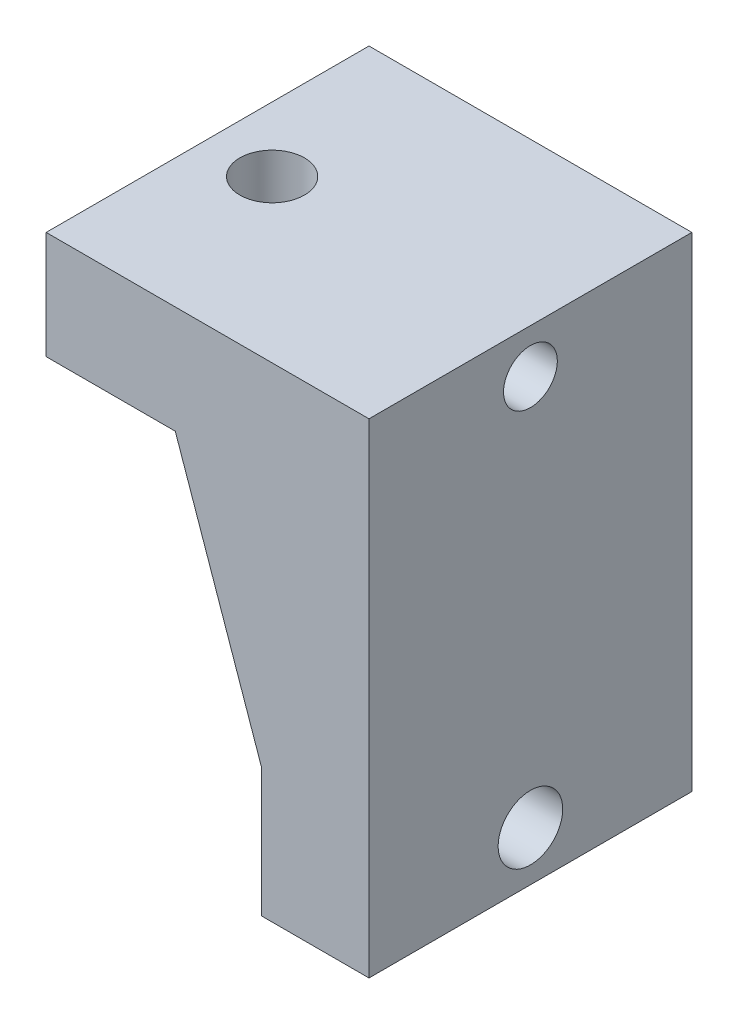
ISO-10303-21;
HEADER;
FILE_DESCRIPTION(('STEP AP214'),'2;1');
FILE_NAME('part.step','',(''),(''),'','','');
FILE_SCHEMA(('AUTOMOTIVE_DESIGN { 1 0 10303 214 1 1 1 1 }'));
ENDSEC;
DATA;
#1=APPLICATION_CONTEXT('core data for automotive mechanical design processes');
#2=APPLICATION_PROTOCOL_DEFINITION('international standard','automotive_design',2000,#1);
#3=PRODUCT_CONTEXT('',#1,'mechanical');
#4=PRODUCT('Part','Part','',(#3));
#5=PRODUCT_RELATED_PRODUCT_CATEGORY('part','',(#4));
#6=PRODUCT_DEFINITION_FORMATION('','',#4);
#7=PRODUCT_DEFINITION_CONTEXT('part definition',#1,'design');
#8=PRODUCT_DEFINITION('design','',#6,#7);
#9=PRODUCT_DEFINITION_SHAPE('','',#8);
#10=(LENGTH_UNIT() NAMED_UNIT(*) SI_UNIT(.MILLI.,.METRE.));
#11=(NAMED_UNIT(*) PLANE_ANGLE_UNIT() SI_UNIT($,.RADIAN.));
#12=(NAMED_UNIT(*) SI_UNIT($,.STERADIAN.) SOLID_ANGLE_UNIT());
#13=UNCERTAINTY_MEASURE_WITH_UNIT(LENGTH_MEASURE(1.E-05),#10,'distance_accuracy_value','');
#14=(GEOMETRIC_REPRESENTATION_CONTEXT(3) GLOBAL_UNCERTAINTY_ASSIGNED_CONTEXT((#13)) GLOBAL_UNIT_ASSIGNED_CONTEXT((#10,
#11,#12)) REPRESENTATION_CONTEXT('',''));
#15=CARTESIAN_POINT('',(0.,0.,0.));
#16=DIRECTION('',(0.,0.,1.));
#17=DIRECTION('',(1.,0.,0.));
#18=AXIS2_PLACEMENT_3D('',#15,#16,#17);
#19=CARTESIAN_POINT('',(0.,-20.,15.));
#20=DIRECTION('',(0.,-1.,0.));
#21=DIRECTION('',(0.,0.,-1.));
#22=AXIS2_PLACEMENT_3D('',#19,#20,#21);
#23=PLANE('',#22);
#24=DIRECTION('',(-1.,0.,0.));
#25=VECTOR('',#24,1.);
#26=CARTESIAN_POINT('',(0.,-20.,0.));
#27=LINE('',#26,#25);
#28=CARTESIAN_POINT('',(7.5,-20.,0.));
#29=VERTEX_POINT('',#28);
#30=CARTESIAN_POINT('',(2.5,-20.,0.));
#31=VERTEX_POINT('',#30);
#32=EDGE_CURVE('E122',#29,#31,#27,.T.);
#33=ORIENTED_EDGE('',*,*,#32,.F.);
#34=DIRECTION('',(0.,0.,-1.));
#35=VECTOR('',#34,1.);
#36=CARTESIAN_POINT('',(7.5,-20.,15.));
#37=LINE('',#36,#35);
#38=CARTESIAN_POINT('',(7.5,-20.,15.));
#39=VERTEX_POINT('',#38);
#40=EDGE_CURVE('E11',#39,#29,#37,.T.);
#41=ORIENTED_EDGE('',*,*,#40,.F.);
#42=DIRECTION('',(-1.,0.,0.));
#43=VECTOR('',#42,1.);
#44=CARTESIAN_POINT('',(0.,-20.,15.));
#45=LINE('',#44,#43);
#46=CARTESIAN_POINT('',(2.5,-20.,15.));
#47=VERTEX_POINT('',#46);
#48=EDGE_CURVE('E138',#39,#47,#45,.T.);
#49=ORIENTED_EDGE('',*,*,#48,.T.);
#50=DIRECTION('',(0.,0.,-1.));
#51=VECTOR('',#50,1.);
#52=CARTESIAN_POINT('',(2.5,-20.,15.));
#53=LINE('',#52,#51);
#54=EDGE_CURVE('E83',#47,#31,#53,.T.);
#55=ORIENTED_EDGE('',*,*,#54,.T.);
#56=EDGE_LOOP('',(#33,#41,#49,#55));
#57=FACE_BOUND('',#56,.T.);
#58=ADVANCED_FACE('F34',(#57),#23,.T.);
#59=CARTESIAN_POINT('',(7.5,0.,15.));
#60=DIRECTION('',(-1.,0.,0.));
#61=DIRECTION('',(0.,-1.,0.));
#62=AXIS2_PLACEMENT_3D('',#59,#60,#61);
#63=PLANE('',#62);
#64=CARTESIAN_POINT('',(7.5,0.450000000000004,7.5));
#65=DIRECTION('',(1.,0.,0.));
#66=DIRECTION('',(0.,1.,0.));
#67=AXIS2_PLACEMENT_3D('',#64,#65,#66);
#68=CIRCLE('',#67,1.25);
#69=CARTESIAN_POINT('',(7.5,1.7,7.5));
#70=VERTEX_POINT('',#69);
#71=EDGE_CURVE('E166',#70,#70,#68,.T.);
#72=ORIENTED_EDGE('',*,*,#71,.F.);
#73=EDGE_LOOP('',(#72));
#74=FACE_BOUND('',#73,.T.);
#75=CARTESIAN_POINT('',(7.50000000000001,-17.7,7.5));
#76=DIRECTION('',(1.,0.,0.));
#77=DIRECTION('',(0.,1.,0.));
#78=AXIS2_PLACEMENT_3D('',#75,#76,#77);
#79=CIRCLE('',#78,1.5);
#80=CARTESIAN_POINT('',(7.50000000000001,-16.2,7.5));
#81=VERTEX_POINT('',#80);
#82=EDGE_CURVE('E163',#81,#81,#79,.T.);
#83=ORIENTED_EDGE('',*,*,#82,.F.);
#84=EDGE_LOOP('',(#83));
#85=FACE_BOUND('',#84,.T.);
#86=DIRECTION('',(0.,1.,0.));
#87=VECTOR('',#86,1.);
#88=CARTESIAN_POINT('',(7.5,0.,0.));
#89=LINE('',#88,#87);
#90=CARTESIAN_POINT('',(7.5,2.5,0.));
#91=VERTEX_POINT('',#90);
#92=EDGE_CURVE('E125',#29,#91,#89,.T.);
#93=ORIENTED_EDGE('',*,*,#92,.T.);
#94=DIRECTION('',(0.,0.,-1.));
#95=VECTOR('',#94,1.);
#96=CARTESIAN_POINT('',(7.5,2.5,15.));
#97=LINE('',#96,#95);
#98=CARTESIAN_POINT('',(7.5,2.5,15.));
#99=VERTEX_POINT('',#98);
#100=EDGE_CURVE('E43',#99,#91,#97,.T.);
#101=ORIENTED_EDGE('',*,*,#100,.F.);
#102=DIRECTION('',(0.,1.,0.));
#103=VECTOR('',#102,1.);
#104=CARTESIAN_POINT('',(7.5,0.,15.));
#105=LINE('',#104,#103);
#106=EDGE_CURVE('E158',#39,#99,#105,.T.);
#107=ORIENTED_EDGE('',*,*,#106,.F.);
#108=ORIENTED_EDGE('',*,*,#40,.T.);
#109=EDGE_LOOP('',(#93,#101,#107,#108));
#110=FACE_BOUND('',#109,.T.);
#111=ADVANCED_FACE('F152',(#74,#85,#110),#63,.F.);
#112=CARTESIAN_POINT('',(0.,2.5,15.));
#113=DIRECTION('',(0.,1.,0.));
#114=DIRECTION('',(0.,0.,1.));
#115=AXIS2_PLACEMENT_3D('',#112,#113,#114);
#116=PLANE('',#115);
#117=CARTESIAN_POINT('',(-4.5,2.5,7.5));
#118=DIRECTION('',(0.,1.,0.));
#119=DIRECTION('',(0.,0.,1.));
#120=AXIS2_PLACEMENT_3D('',#117,#118,#119);
#121=CIRCLE('',#120,1.5);
#122=CARTESIAN_POINT('',(-4.5,2.5,9.));
#123=VERTEX_POINT('',#122);
#124=EDGE_CURVE('E167',#123,#123,#121,.T.);
#125=ORIENTED_EDGE('',*,*,#124,.F.);
#126=EDGE_LOOP('',(#125));
#127=FACE_BOUND('',#126,.T.);
#128=DIRECTION('',(1.,0.,0.));
#129=VECTOR('',#128,1.);
#130=CARTESIAN_POINT('',(0.,2.5,0.));
#131=LINE('',#130,#129);
#132=CARTESIAN_POINT('',(-7.5,2.5,0.));
#133=VERTEX_POINT('',#132);
#134=EDGE_CURVE('E128',#133,#91,#131,.T.);
#135=ORIENTED_EDGE('',*,*,#134,.F.);
#136=DIRECTION('',(0.,0.,-1.));
#137=VECTOR('',#136,1.);
#138=CARTESIAN_POINT('',(-7.5,2.5,15.));
#139=LINE('',#138,#137);
#140=CARTESIAN_POINT('',(-7.5,2.5,15.));
#141=VERTEX_POINT('',#140);
#142=EDGE_CURVE('E142',#141,#133,#139,.T.);
#143=ORIENTED_EDGE('',*,*,#142,.F.);
#144=DIRECTION('',(1.,0.,0.));
#145=VECTOR('',#144,1.);
#146=CARTESIAN_POINT('',(0.,2.5,15.));
#147=LINE('',#146,#145);
#148=EDGE_CURVE('E149',#141,#99,#147,.T.);
#149=ORIENTED_EDGE('',*,*,#148,.T.);
#150=ORIENTED_EDGE('',*,*,#100,.T.);
#151=EDGE_LOOP('',(#135,#143,#149,#150));
#152=FACE_BOUND('',#151,.T.);
#153=ADVANCED_FACE('F148',(#127,#152),#116,.T.);
#154=CARTESIAN_POINT('',(-7.5,0.,15.));
#155=DIRECTION('',(-1.,0.,0.));
#156=DIRECTION('',(0.,0.,1.));
#157=AXIS2_PLACEMENT_3D('',#154,#155,#156);
#158=PLANE('',#157);
#159=DIRECTION('',(0.,1.,0.));
#160=VECTOR('',#159,1.);
#161=CARTESIAN_POINT('',(-7.5,0.,0.));
#162=LINE('',#161,#160);
#163=CARTESIAN_POINT('',(-7.5,-2.5,0.));
#164=VERTEX_POINT('',#163);
#165=EDGE_CURVE('E131',#164,#133,#162,.T.);
#166=ORIENTED_EDGE('',*,*,#165,.F.);
#167=DIRECTION('',(0.,0.,-1.));
#168=VECTOR('',#167,1.);
#169=CARTESIAN_POINT('',(-7.5,-2.5,15.));
#170=LINE('',#169,#168);
#171=CARTESIAN_POINT('',(-7.5,-2.5,15.));
#172=VERTEX_POINT('',#171);
#173=EDGE_CURVE('E114',#172,#164,#170,.T.);
#174=ORIENTED_EDGE('',*,*,#173,.F.);
#175=DIRECTION('',(0.,1.,0.));
#176=VECTOR('',#175,1.);
#177=CARTESIAN_POINT('',(-7.5,0.,15.));
#178=LINE('',#177,#176);
#179=EDGE_CURVE('E107',#172,#141,#178,.T.);
#180=ORIENTED_EDGE('',*,*,#179,.T.);
#181=ORIENTED_EDGE('',*,*,#142,.T.);
#182=EDGE_LOOP('',(#166,#174,#180,#181));
#183=FACE_BOUND('',#182,.T.);
#184=ADVANCED_FACE('F157',(#183),#158,.T.);
#185=CARTESIAN_POINT('',(0.,-2.5,15.));
#186=DIRECTION('',(0.,1.,0.));
#187=DIRECTION('',(0.,0.,1.));
#188=AXIS2_PLACEMENT_3D('',#185,#186,#187);
#189=PLANE('',#188);
#190=CARTESIAN_POINT('',(-4.5,-2.5,7.5));
#191=DIRECTION('',(0.,-1.,0.));
#192=DIRECTION('',(0.,0.,-1.));
#193=AXIS2_PLACEMENT_3D('',#190,#191,#192);
#194=CIRCLE('',#193,1.5);
#195=CARTESIAN_POINT('',(-4.5,-2.5,6.));
#196=VERTEX_POINT('',#195);
#197=EDGE_CURVE('E175',#196,#196,#194,.T.);
#198=ORIENTED_EDGE('',*,*,#197,.F.);
#199=EDGE_LOOP('',(#198));
#200=FACE_BOUND('',#199,.T.);
#201=DIRECTION('',(1.,0.,0.));
#202=VECTOR('',#201,1.);
#203=CARTESIAN_POINT('',(0.,-2.5,0.));
#204=LINE('',#203,#202);
#205=CARTESIAN_POINT('',(-1.5,-2.5,0.));
#206=VERTEX_POINT('',#205);
#207=EDGE_CURVE('E113',#164,#206,#204,.T.);
#208=ORIENTED_EDGE('',*,*,#207,.T.);
#209=DIRECTION('',(0.,0.,-1.));
#210=VECTOR('',#209,1.);
#211=CARTESIAN_POINT('',(-1.5,-2.5,15.));
#212=LINE('',#211,#210);
#213=CARTESIAN_POINT('',(-1.5,-2.5,15.));
#214=VERTEX_POINT('',#213);
#215=EDGE_CURVE('E110',#214,#206,#212,.T.);
#216=ORIENTED_EDGE('',*,*,#215,.F.);
#217=DIRECTION('',(1.,0.,0.));
#218=VECTOR('',#217,1.);
#219=CARTESIAN_POINT('',(0.,-2.5,15.));
#220=LINE('',#219,#218);
#221=EDGE_CURVE('E100',#172,#214,#220,.T.);
#222=ORIENTED_EDGE('',*,*,#221,.F.);
#223=ORIENTED_EDGE('',*,*,#173,.T.);
#224=EDGE_LOOP('',(#208,#216,#222,#223));
#225=FACE_BOUND('',#224,.T.);
#226=ADVANCED_FACE('F111',(#200,#225),#189,.F.);
#227=CARTESIAN_POINT('',(-2.11382799325464,-0.735244519392916,15.));
#228=DIRECTION('',(0.944496796706159,0.328520624941273,0.));
#229=DIRECTION('',(-0.328520624941273,0.944496796706159,0.));
#230=AXIS2_PLACEMENT_3D('',#227,#228,#229);
#231=PLANE('',#230);
#232=DIRECTION('',(0.328520624941273,-0.944496796706159,0.));
#233=VECTOR('',#232,1.);
#234=CARTESIAN_POINT('',(-2.11382799325464,-0.735244519392916,0.));
#235=LINE('',#234,#233);
#236=CARTESIAN_POINT('',(2.5,-14.,0.));
#237=VERTEX_POINT('',#236);
#238=EDGE_CURVE('E76',#206,#237,#235,.T.);
#239=ORIENTED_EDGE('',*,*,#238,.T.);
#240=DIRECTION('',(0.,0.,-1.));
#241=VECTOR('',#240,1.);
#242=CARTESIAN_POINT('',(2.5,-14.,15.));
#243=LINE('',#242,#241);
#244=CARTESIAN_POINT('',(2.5,-14.,15.));
#245=VERTEX_POINT('',#244);
#246=EDGE_CURVE('E115',#245,#237,#243,.T.);
#247=ORIENTED_EDGE('',*,*,#246,.F.);
#248=DIRECTION('',(0.328520624941273,-0.944496796706159,0.));
#249=VECTOR('',#248,1.);
#250=CARTESIAN_POINT('',(-2.11382799325464,-0.735244519392916,15.));
#251=LINE('',#250,#249);
#252=EDGE_CURVE('E104',#214,#245,#251,.T.);
#253=ORIENTED_EDGE('',*,*,#252,.F.);
#254=ORIENTED_EDGE('',*,*,#215,.T.);
#255=EDGE_LOOP('',(#239,#247,#253,#254));
#256=FACE_BOUND('',#255,.T.);
#257=ADVANCED_FACE('F117',(#256),#231,.F.);
#258=CARTESIAN_POINT('',(2.5,0.,15.));
#259=DIRECTION('',(1.,0.,0.));
#260=DIRECTION('',(0.,1.,0.));
#261=AXIS2_PLACEMENT_3D('',#258,#259,#260);
#262=PLANE('',#261);
#263=CARTESIAN_POINT('',(2.5,-17.7,7.5));
#264=DIRECTION('',(1.,0.,0.));
#265=DIRECTION('',(0.,1.,0.));
#266=AXIS2_PLACEMENT_3D('',#263,#264,#265);
#267=CIRCLE('',#266,1.5);
#268=CARTESIAN_POINT('',(2.5,-16.2,7.5));
#269=VERTEX_POINT('',#268);
#270=EDGE_CURVE('E37',#269,#269,#267,.T.);
#271=ORIENTED_EDGE('',*,*,#270,.T.);
#272=EDGE_LOOP('',(#271));
#273=FACE_BOUND('',#272,.T.);
#274=DIRECTION('',(0.,-1.,0.));
#275=VECTOR('',#274,1.);
#276=CARTESIAN_POINT('',(2.5,0.,0.));
#277=LINE('',#276,#275);
#278=EDGE_CURVE('E136',#237,#31,#277,.T.);
#279=ORIENTED_EDGE('',*,*,#278,.T.);
#280=ORIENTED_EDGE('',*,*,#54,.F.);
#281=DIRECTION('',(0.,-1.,0.));
#282=VECTOR('',#281,1.);
#283=CARTESIAN_POINT('',(2.5,0.,15.));
#284=LINE('',#283,#282);
#285=EDGE_CURVE('E51',#245,#47,#284,.T.);
#286=ORIENTED_EDGE('',*,*,#285,.F.);
#287=ORIENTED_EDGE('',*,*,#246,.T.);
#288=EDGE_LOOP('',(#279,#280,#286,#287));
#289=FACE_BOUND('',#288,.T.);
#290=ADVANCED_FACE('F187',(#273,#289),#262,.F.);
#291=CARTESIAN_POINT('',(0.,0.,15.));
#292=DIRECTION('',(0.,0.,1.));
#293=DIRECTION('',(1.,0.,0.));
#294=AXIS2_PLACEMENT_3D('',#291,#292,#293);
#295=PLANE('',#294);
#296=ORIENTED_EDGE('',*,*,#48,.F.);
#297=ORIENTED_EDGE('',*,*,#106,.T.);
#298=ORIENTED_EDGE('',*,*,#148,.F.);
#299=ORIENTED_EDGE('',*,*,#179,.F.);
#300=ORIENTED_EDGE('',*,*,#221,.T.);
#301=ORIENTED_EDGE('',*,*,#252,.T.);
#302=ORIENTED_EDGE('',*,*,#285,.T.);
#303=EDGE_LOOP('',(#296,#297,#298,#299,#300,#301,#302));
#304=FACE_BOUND('',#303,.T.);
#305=ADVANCED_FACE('F102',(#304),#295,.T.);
#306=CARTESIAN_POINT('',(0.,0.,0.));
#307=DIRECTION('',(0.,0.,1.));
#308=DIRECTION('',(1.,0.,0.));
#309=AXIS2_PLACEMENT_3D('',#306,#307,#308);
#310=PLANE('',#309);
#311=ORIENTED_EDGE('',*,*,#32,.T.);
#312=ORIENTED_EDGE('',*,*,#278,.F.);
#313=ORIENTED_EDGE('',*,*,#238,.F.);
#314=ORIENTED_EDGE('',*,*,#207,.F.);
#315=ORIENTED_EDGE('',*,*,#165,.T.);
#316=ORIENTED_EDGE('',*,*,#134,.T.);
#317=ORIENTED_EDGE('',*,*,#92,.F.);
#318=EDGE_LOOP('',(#311,#312,#313,#314,#315,#316,#317));
#319=FACE_BOUND('',#318,.T.);
#320=ADVANCED_FACE('F154',(#319),#310,.F.);
#321=CARTESIAN_POINT('',(-1.49999999999998,-17.7,7.5));
#322=DIRECTION('',(1.,0.,0.));
#323=DIRECTION('',(0.,1.,0.));
#324=AXIS2_PLACEMENT_3D('',#321,#322,#323);
#325=CYLINDRICAL_SURFACE('',#324,1.5);
#326=ORIENTED_EDGE('',*,*,#82,.T.);
#327=EDGE_LOOP('',(#326));
#328=FACE_BOUND('',#327,.T.);
#329=ORIENTED_EDGE('',*,*,#270,.F.);
#330=EDGE_LOOP('',(#329));
#331=FACE_BOUND('',#330,.T.);
#332=ADVANCED_FACE('F207',(#328,#331),#325,.F.);
#333=CARTESIAN_POINT('',(-1.5,0.449999999999998,7.5));
#334=DIRECTION('',(1.,0.,0.));
#335=DIRECTION('',(0.,1.,0.));
#336=AXIS2_PLACEMENT_3D('',#333,#334,#335);
#337=CYLINDRICAL_SURFACE('',#336,1.25);
#338=CARTESIAN_POINT('',(-1.5,0.449999999999998,7.5));
#339=DIRECTION('',(1.,0.,0.));
#340=DIRECTION('',(0.,1.,0.));
#341=AXIS2_PLACEMENT_3D('',#338,#339,#340);
#342=CIRCLE('',#341,1.25);
#343=CARTESIAN_POINT('',(-1.5,1.7,7.5));
#344=VERTEX_POINT('',#343);
#345=EDGE_CURVE('E170',#344,#344,#342,.T.);
#346=ORIENTED_EDGE('',*,*,#345,.F.);
#347=EDGE_LOOP('',(#346));
#348=FACE_BOUND('',#347,.T.);
#349=ORIENTED_EDGE('',*,*,#71,.T.);
#350=EDGE_LOOP('',(#349));
#351=FACE_BOUND('',#350,.T.);
#352=ADVANCED_FACE('F211',(#348,#351),#337,.F.);
#353=CARTESIAN_POINT('',(-1.5,0.449999999999998,7.5));
#354=DIRECTION('',(1.,0.,0.));
#355=DIRECTION('',(0.,1.,0.));
#356=AXIS2_PLACEMENT_3D('',#353,#354,#355);
#357=PLANE('',#356);
#358=ORIENTED_EDGE('',*,*,#345,.T.);
#359=EDGE_LOOP('',(#358));
#360=FACE_BOUND('',#359,.T.);
#361=ADVANCED_FACE('F215',(#360),#357,.T.);
#362=CARTESIAN_POINT('',(-4.5,6.5,7.5));
#363=DIRECTION('',(0.,-1.,0.));
#364=DIRECTION('',(0.,0.,-1.));
#365=AXIS2_PLACEMENT_3D('',#362,#363,#364);
#366=CYLINDRICAL_SURFACE('',#365,1.5);
#367=ORIENTED_EDGE('',*,*,#124,.T.);
#368=EDGE_LOOP('',(#367));
#369=FACE_BOUND('',#368,.T.);
#370=ORIENTED_EDGE('',*,*,#197,.T.);
#371=EDGE_LOOP('',(#370));
#372=FACE_BOUND('',#371,.T.);
#373=ADVANCED_FACE('F179',(#369,#372),#366,.F.);
#374=CLOSED_SHELL('',(#58,#111,#153,#184,#226,#257,#290,#305,#320,#332,#352,#361,#373));
#375=MANIFOLD_SOLID_BREP('B2',#374);
#376=ADVANCED_BREP_SHAPE_REPRESENTATION('',(#18,#375),#14);
#377=SHAPE_DEFINITION_REPRESENTATION(#9,#376);
ENDSEC;
END-ISO-10303-21;
